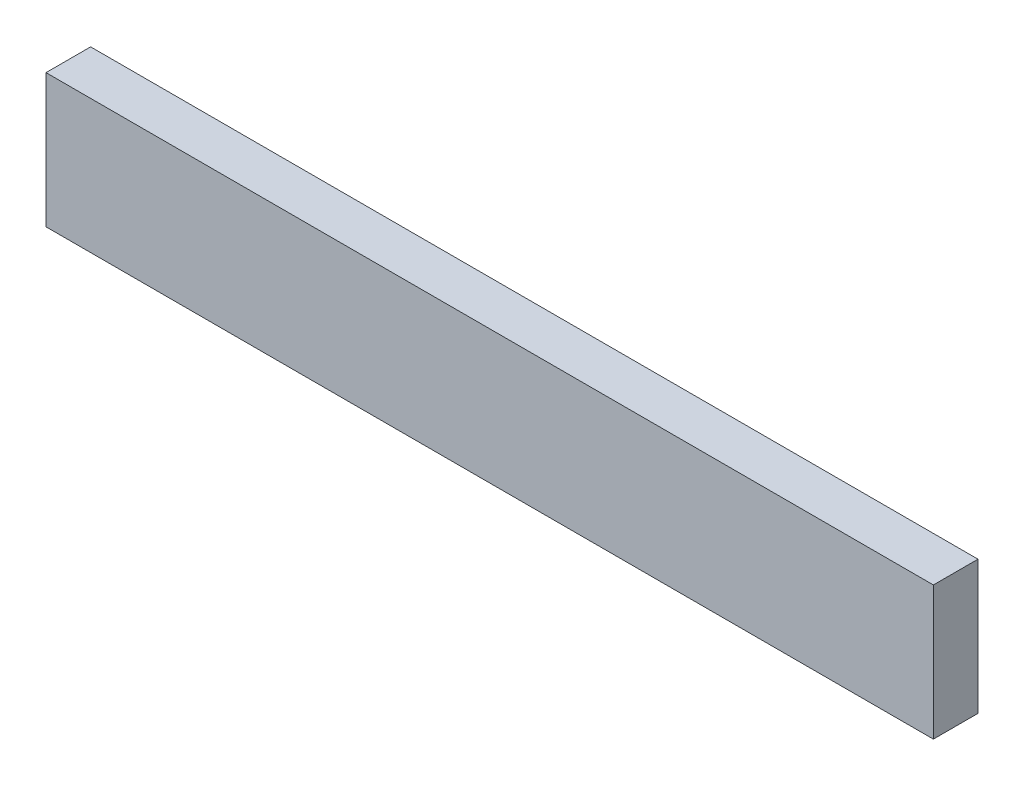
ISO-10303-21;
HEADER;
FILE_DESCRIPTION(('STEP AP214'),'2;1');
FILE_NAME('part.step','',(''),(''),'','','');
FILE_SCHEMA(('AUTOMOTIVE_DESIGN { 1 0 10303 214 1 1 1 1 }'));
ENDSEC;
DATA;
#1=APPLICATION_CONTEXT('core data for automotive mechanical design processes');
#2=APPLICATION_PROTOCOL_DEFINITION('international standard','automotive_design',2000,#1);
#3=PRODUCT_CONTEXT('',#1,'mechanical');
#4=PRODUCT('Part','Part','',(#3));
#5=PRODUCT_RELATED_PRODUCT_CATEGORY('part','',(#4));
#6=PRODUCT_DEFINITION_FORMATION('','',#4);
#7=PRODUCT_DEFINITION_CONTEXT('part definition',#1,'design');
#8=PRODUCT_DEFINITION('design','',#6,#7);
#9=PRODUCT_DEFINITION_SHAPE('','',#8);
#10=(LENGTH_UNIT() NAMED_UNIT(*) SI_UNIT(.MILLI.,.METRE.));
#11=(NAMED_UNIT(*) PLANE_ANGLE_UNIT() SI_UNIT($,.RADIAN.));
#12=(NAMED_UNIT(*) SI_UNIT($,.STERADIAN.) SOLID_ANGLE_UNIT());
#13=UNCERTAINTY_MEASURE_WITH_UNIT(LENGTH_MEASURE(1.E-05),#10,'distance_accuracy_value','');
#14=(GEOMETRIC_REPRESENTATION_CONTEXT(3) GLOBAL_UNCERTAINTY_ASSIGNED_CONTEXT((#13)) GLOBAL_UNIT_ASSIGNED_CONTEXT((#10,
#11,#12)) REPRESENTATION_CONTEXT('',''));
#15=CARTESIAN_POINT('',(0.,0.,0.));
#16=DIRECTION('',(0.,0.,1.));
#17=DIRECTION('',(1.,0.,0.));
#18=AXIS2_PLACEMENT_3D('',#15,#16,#17);
#19=CARTESIAN_POINT('',(139.2,20.95,14.));
#20=DIRECTION('',(-1.,0.,0.));
#21=DIRECTION('',(0.,0.,1.));
#22=AXIS2_PLACEMENT_3D('',#19,#20,#21);
#23=PLANE('',#22);
#24=DIRECTION('',(0.,1.,0.));
#25=VECTOR('',#24,1.);
#26=CARTESIAN_POINT('',(139.2,20.95,0.));
#27=LINE('',#26,#25);
#28=CARTESIAN_POINT('',(139.2,-20.95,0.));
#29=VERTEX_POINT('',#28);
#30=CARTESIAN_POINT('',(139.2,20.95,0.));
#31=VERTEX_POINT('',#30);
#32=EDGE_CURVE('E96',#29,#31,#27,.T.);
#33=ORIENTED_EDGE('',*,*,#32,.T.);
#34=DIRECTION('',(0.,0.,-1.));
#35=VECTOR('',#34,1.);
#36=CARTESIAN_POINT('',(139.2,20.95,14.));
#37=LINE('',#36,#35);
#38=CARTESIAN_POINT('',(139.2,20.95,14.));
#39=VERTEX_POINT('',#38);
#40=EDGE_CURVE('E11',#39,#31,#37,.T.);
#41=ORIENTED_EDGE('',*,*,#40,.F.);
#42=DIRECTION('',(0.,1.,0.));
#43=VECTOR('',#42,1.);
#44=CARTESIAN_POINT('',(139.2,20.95,14.));
#45=LINE('',#44,#43);
#46=CARTESIAN_POINT('',(139.2,-20.95,14.));
#47=VERTEX_POINT('',#46);
#48=EDGE_CURVE('E84',#47,#39,#45,.T.);
#49=ORIENTED_EDGE('',*,*,#48,.F.);
#50=DIRECTION('',(0.,0.,-1.));
#51=VECTOR('',#50,1.);
#52=CARTESIAN_POINT('',(139.2,-20.95,14.));
#53=LINE('',#52,#51);
#54=EDGE_CURVE('E92',#47,#29,#53,.T.);
#55=ORIENTED_EDGE('',*,*,#54,.T.);
#56=EDGE_LOOP('',(#33,#41,#49,#55));
#57=FACE_BOUND('',#56,.T.);
#58=ADVANCED_FACE('F33',(#57),#23,.F.);
#59=CARTESIAN_POINT('',(-139.2,20.95,14.));
#60=DIRECTION('',(0.,-1.,0.));
#61=DIRECTION('',(0.,0.,-1.));
#62=AXIS2_PLACEMENT_3D('',#59,#60,#61);
#63=PLANE('',#62);
#64=DIRECTION('',(-1.,0.,0.));
#65=VECTOR('',#64,1.);
#66=CARTESIAN_POINT('',(-139.2,20.95,0.));
#67=LINE('',#66,#65);
#68=CARTESIAN_POINT('',(-139.2,20.95,0.));
#69=VERTEX_POINT('',#68);
#70=EDGE_CURVE('E88',#31,#69,#67,.T.);
#71=ORIENTED_EDGE('',*,*,#70,.T.);
#72=DIRECTION('',(0.,0.,-1.));
#73=VECTOR('',#72,1.);
#74=CARTESIAN_POINT('',(-139.2,20.95,14.));
#75=LINE('',#74,#73);
#76=CARTESIAN_POINT('',(-139.2,20.95,14.));
#77=VERTEX_POINT('',#76);
#78=EDGE_CURVE('E41',#77,#69,#75,.T.);
#79=ORIENTED_EDGE('',*,*,#78,.F.);
#80=DIRECTION('',(-1.,0.,0.));
#81=VECTOR('',#80,1.);
#82=CARTESIAN_POINT('',(-139.2,20.95,14.));
#83=LINE('',#82,#81);
#84=EDGE_CURVE('E79',#39,#77,#83,.T.);
#85=ORIENTED_EDGE('',*,*,#84,.F.);
#86=ORIENTED_EDGE('',*,*,#40,.T.);
#87=EDGE_LOOP('',(#71,#79,#85,#86));
#88=FACE_BOUND('',#87,.T.);
#89=ADVANCED_FACE('F87',(#88),#63,.F.);
#90=CARTESIAN_POINT('',(-139.2,20.95,14.));
#91=DIRECTION('',(1.,0.,0.));
#92=DIRECTION('',(0.,0.,-1.));
#93=AXIS2_PLACEMENT_3D('',#90,#91,#92);
#94=PLANE('',#93);
#95=DIRECTION('',(0.,-1.,0.));
#96=VECTOR('',#95,1.);
#97=CARTESIAN_POINT('',(-139.2,20.95,0.));
#98=LINE('',#97,#96);
#99=CARTESIAN_POINT('',(-139.2,-20.95,0.));
#100=VERTEX_POINT('',#99);
#101=EDGE_CURVE('E66',#69,#100,#98,.T.);
#102=ORIENTED_EDGE('',*,*,#101,.T.);
#103=DIRECTION('',(0.,0.,-1.));
#104=VECTOR('',#103,1.);
#105=CARTESIAN_POINT('',(-139.2,-20.95,14.));
#106=LINE('',#105,#104);
#107=CARTESIAN_POINT('',(-139.2,-20.95,14.));
#108=VERTEX_POINT('',#107);
#109=EDGE_CURVE('E89',#108,#100,#106,.T.);
#110=ORIENTED_EDGE('',*,*,#109,.F.);
#111=DIRECTION('',(0.,-1.,0.));
#112=VECTOR('',#111,1.);
#113=CARTESIAN_POINT('',(-139.2,20.95,14.));
#114=LINE('',#113,#112);
#115=EDGE_CURVE('E82',#77,#108,#114,.T.);
#116=ORIENTED_EDGE('',*,*,#115,.F.);
#117=ORIENTED_EDGE('',*,*,#78,.T.);
#118=EDGE_LOOP('',(#102,#110,#116,#117));
#119=FACE_BOUND('',#118,.T.);
#120=ADVANCED_FACE('F90',(#119),#94,.F.);
#121=CARTESIAN_POINT('',(-139.2,-20.95,14.));
#122=DIRECTION('',(0.,1.,0.));
#123=DIRECTION('',(0.,0.,1.));
#124=AXIS2_PLACEMENT_3D('',#121,#122,#123);
#125=PLANE('',#124);
#126=DIRECTION('',(1.,0.,0.));
#127=VECTOR('',#126,1.);
#128=CARTESIAN_POINT('',(-139.2,-20.95,0.));
#129=LINE('',#128,#127);
#130=EDGE_CURVE('E72',#100,#29,#129,.T.);
#131=ORIENTED_EDGE('',*,*,#130,.T.);
#132=ORIENTED_EDGE('',*,*,#54,.F.);
#133=DIRECTION('',(1.,0.,0.));
#134=VECTOR('',#133,1.);
#135=CARTESIAN_POINT('',(-139.2,-20.95,14.));
#136=LINE('',#135,#134);
#137=EDGE_CURVE('E49',#108,#47,#136,.T.);
#138=ORIENTED_EDGE('',*,*,#137,.F.);
#139=ORIENTED_EDGE('',*,*,#109,.T.);
#140=EDGE_LOOP('',(#131,#132,#138,#139));
#141=FACE_BOUND('',#140,.T.);
#142=ADVANCED_FACE('F103',(#141),#125,.F.);
#143=CARTESIAN_POINT('',(0.,0.,14.));
#144=DIRECTION('',(0.,0.,1.));
#145=DIRECTION('',(1.,0.,0.));
#146=AXIS2_PLACEMENT_3D('',#143,#144,#145);
#147=PLANE('',#146);
#148=ORIENTED_EDGE('',*,*,#48,.T.);
#149=ORIENTED_EDGE('',*,*,#84,.T.);
#150=ORIENTED_EDGE('',*,*,#115,.T.);
#151=ORIENTED_EDGE('',*,*,#137,.T.);
#152=EDGE_LOOP('',(#148,#149,#150,#151));
#153=FACE_BOUND('',#152,.T.);
#154=ADVANCED_FACE('F80',(#153),#147,.T.);
#155=CARTESIAN_POINT('',(0.,0.,0.));
#156=DIRECTION('',(0.,0.,1.));
#157=DIRECTION('',(1.,0.,0.));
#158=AXIS2_PLACEMENT_3D('',#155,#156,#157);
#159=PLANE('',#158);
#160=ORIENTED_EDGE('',*,*,#32,.F.);
#161=ORIENTED_EDGE('',*,*,#130,.F.);
#162=ORIENTED_EDGE('',*,*,#101,.F.);
#163=ORIENTED_EDGE('',*,*,#70,.F.);
#164=EDGE_LOOP('',(#160,#161,#162,#163));
#165=FACE_BOUND('',#164,.T.);
#166=ADVANCED_FACE('F106',(#165),#159,.F.);
#167=CLOSED_SHELL('',(#58,#89,#120,#142,#154,#166));
#168=MANIFOLD_SOLID_BREP('B2',#167);
#169=ADVANCED_BREP_SHAPE_REPRESENTATION('',(#18,#168),#14);
#170=SHAPE_DEFINITION_REPRESENTATION(#9,#169);
ENDSEC;
END-ISO-10303-21;
